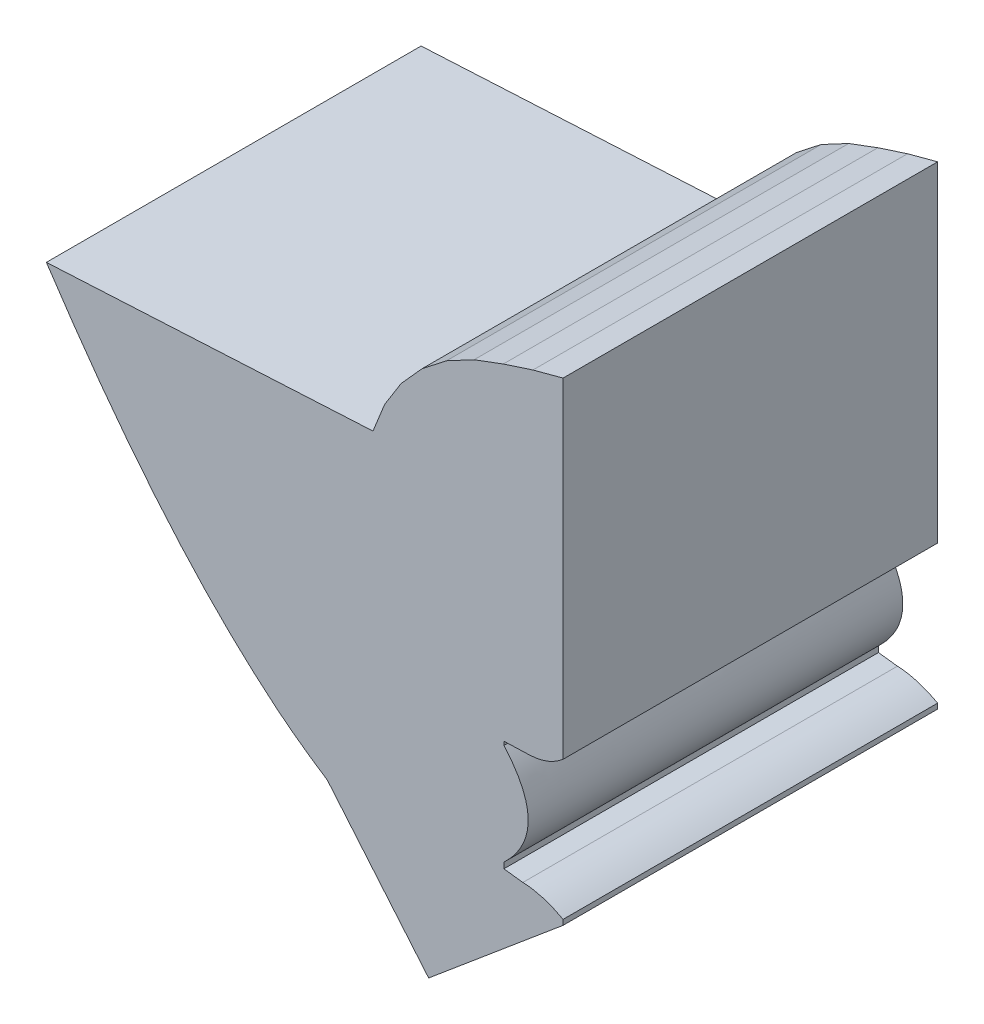
ISO-10303-21;
HEADER;
FILE_DESCRIPTION(('STEP AP214'),'2;1');
FILE_NAME('part.step','',(''),(''),'','','');
FILE_SCHEMA(('AUTOMOTIVE_DESIGN { 1 0 10303 214 1 1 1 1 }'));
ENDSEC;
DATA;
#1=APPLICATION_CONTEXT('core data for automotive mechanical design processes');
#2=APPLICATION_PROTOCOL_DEFINITION('international standard','automotive_design',2000,#1);
#3=PRODUCT_CONTEXT('',#1,'mechanical');
#4=PRODUCT('Part','Part','',(#3));
#5=PRODUCT_RELATED_PRODUCT_CATEGORY('part','',(#4));
#6=PRODUCT_DEFINITION_FORMATION('','',#4);
#7=PRODUCT_DEFINITION_CONTEXT('part definition',#1,'design');
#8=PRODUCT_DEFINITION('design','',#6,#7);
#9=PRODUCT_DEFINITION_SHAPE('','',#8);
#10=(LENGTH_UNIT() NAMED_UNIT(*) SI_UNIT(.MILLI.,.METRE.));
#11=(NAMED_UNIT(*) PLANE_ANGLE_UNIT() SI_UNIT($,.RADIAN.));
#12=(NAMED_UNIT(*) SI_UNIT($,.STERADIAN.) SOLID_ANGLE_UNIT());
#13=UNCERTAINTY_MEASURE_WITH_UNIT(LENGTH_MEASURE(1.E-05),#10,'distance_accuracy_value','');
#14=(GEOMETRIC_REPRESENTATION_CONTEXT(3) GLOBAL_UNCERTAINTY_ASSIGNED_CONTEXT((#13)) GLOBAL_UNIT_ASSIGNED_CONTEXT((#10,
#11,#12)) REPRESENTATION_CONTEXT('',''));
#15=CARTESIAN_POINT('',(0.,0.,0.));
#16=DIRECTION('',(0.,0.,1.));
#17=DIRECTION('',(1.,0.,0.));
#18=AXIS2_PLACEMENT_3D('',#15,#16,#17);
#19=CARTESIAN_POINT('',(-2.17733041778456,0.,7.21));
#20=DIRECTION('',(1.,0.,0.));
#21=DIRECTION('',(0.,1.,0.));
#22=AXIS2_PLACEMENT_3D('',#19,#20,#21);
#23=PLANE('',#22);
#24=DIRECTION('',(0.,1.,0.));
#25=VECTOR('',#24,1.);
#26=CARTESIAN_POINT('',(-2.17733041778456,0.,7.21));
#27=LINE('',#26,#25);
#28=CARTESIAN_POINT('',(-2.17733041779455,-1.68817652024789,7.21));
#29=VERTEX_POINT('',#28);
#30=CARTESIAN_POINT('',(-2.17733041778456,-1.91156169539301,7.21));
#31=VERTEX_POINT('',#30);
#32=EDGE_CURVE('E555',#29,#31,#27,.F.);
#33=ORIENTED_EDGE('',*,*,#32,.T.);
#34=DIRECTION('',(0.,0.,-1.));
#35=VECTOR('',#34,1.);
#36=CARTESIAN_POINT('',(-2.17733041778456,-1.91156169539301,7.21));
#37=LINE('',#36,#35);
#38=CARTESIAN_POINT('',(-2.17733041778456,-1.91156169539301,-7.21));
#39=VERTEX_POINT('',#38);
#40=EDGE_CURVE('E13',#31,#39,#37,.T.);
#41=ORIENTED_EDGE('',*,*,#40,.T.);
#42=DIRECTION('',(0.,1.,0.));
#43=VECTOR('',#42,1.);
#44=CARTESIAN_POINT('',(-2.17733041778456,0.,-7.21));
#45=LINE('',#44,#43);
#46=CARTESIAN_POINT('',(-2.17733041778456,-1.68817652020115,-7.21));
#47=VERTEX_POINT('',#46);
#48=EDGE_CURVE('E222',#47,#39,#45,.F.);
#49=ORIENTED_EDGE('',*,*,#48,.F.);
#50=DIRECTION('',(0.,0.,-1.));
#51=VECTOR('',#50,1.);
#52=CARTESIAN_POINT('',(-2.17733041778328,-1.68817652023794,30.8299178698776));
#53=LINE('',#52,#51);
#54=EDGE_CURVE('E595',#29,#47,#53,.T.);
#55=ORIENTED_EDGE('',*,*,#54,.F.);
#56=EDGE_LOOP('',(#33,#41,#49,#55));
#57=FACE_BOUND('',#56,.T.);
#58=ADVANCED_FACE('F59',(#57),#23,.T.);
#59=CARTESIAN_POINT('',(-82931.1005830976,996560.072871644,30.8299178698776));
#60=CARTESIAN_POINT('',(87153.8887538027,-996199.093812144,30.8299178698776));
#61=CARTESIAN_POINT('',(-91384.0928999308,995820.531871049,30.8299178698776));
#62=B_SPLINE_CURVE_WITH_KNOTS('',2,(#59,#60,#61),.UNSPECIFIED.,.F.,.F.,(3,3),(0.,1.),.UNSPECIFIED.);
#63=DIRECTION('',(0.,0.,-1.));
#64=VECTOR('',#63,1.);
#65=SURFACE_OF_LINEAR_EXTRUSION('',#62,#64);
#66=CARTESIAN_POINT('',(-10.3360060158814,-1.39847805227686,-7.21));
#67=CARTESIAN_POINT('',(-9.65069552469905,-1.92048804823903,-7.21));
#68=CARTESIAN_POINT('',(-8.97324904069641,-2.35261203082771,-7.21));
#69=B_SPLINE_CURVE_WITH_KNOTS('',2,(#66,#67,#68),.UNSPECIFIED.,.F.,.F.,(3,3),(0.50081483398574,
0.500965025000237),.UNSPECIFIED.);
#70=CARTESIAN_POINT('',(-10.3360060158632,-1.39847805228234,-7.2125366176972));
#71=VERTEX_POINT('',#70);
#72=CARTESIAN_POINT('',(-8.97324903911193,-2.35261203133745,-7.21));
#73=VERTEX_POINT('',#72);
#74=EDGE_CURVE('E551',#71,#73,#69,.T.);
#75=ORIENTED_EDGE('',*,*,#74,.T.);
#76=DIRECTION('',(0.,0.,-1.));
#77=VECTOR('',#76,1.);
#78=CARTESIAN_POINT('',(-8.97324903822749,-2.35261203239279,0.));
#79=LINE('',#78,#77);
#80=CARTESIAN_POINT('',(-8.97324904075851,-2.35261203079572,7.21));
#81=VERTEX_POINT('',#80);
#82=EDGE_CURVE('E65',#73,#81,#79,.F.);
#83=ORIENTED_EDGE('',*,*,#82,.T.);
#84=CARTESIAN_POINT('',(-8.97324904075525,-2.35261203078885,7.21));
#85=CARTESIAN_POINT('',(-9.65069552472817,-1.92048804821554,7.21));
#86=CARTESIAN_POINT('',(-10.3360060158801,-1.39847805227672,7.21));
#87=B_SPLINE_CURVE_WITH_KNOTS('',2,(#84,#85,#86),.UNSPECIFIED.,.F.,.F.,(3,3),(0.500814833985746,
0.500965025000236),.UNSPECIFIED.);
#88=CARTESIAN_POINT('',(-10.3360060158816,-1.39847805227263,7.21251805157951));
#89=VERTEX_POINT('',#88);
#90=EDGE_CURVE('E521',#89,#81,#87,.F.);
#91=ORIENTED_EDGE('',*,*,#90,.F.);
#92=CARTESIAN_POINT('',(-10.336006015861,-1.39847805228632,7.21));
#93=CARTESIAN_POINT('',(-10.6228848167366,-1.17995870432205,7.21));
#94=CARTESIAN_POINT('',(-10.9111416710362,-0.945688133646021,7.21));
#95=B_SPLINE_CURVE_WITH_KNOTS('',2,(#92,#93,#94),.UNSPECIFIED.,.F.,.F.,(3,3),(0.500965025000234,
0.501027896674745),.UNSPECIFIED.);
#96=CARTESIAN_POINT('',(-10.9111416711035,-0.945688133586594,7.21251805157951));
#97=VERTEX_POINT('',#96);
#98=EDGE_CURVE('E456',#97,#89,#95,.F.);
#99=ORIENTED_EDGE('',*,*,#98,.F.);
#100=CARTESIAN_POINT('',(-10.9111416711694,-0.945688133531575,7.21));
#101=CARTESIAN_POINT('',(-15.1971813204195,2.53763911301365,7.21));
#102=CARTESIAN_POINT('',(-19.7878835648669,9.50327575735757,7.21));
#103=B_SPLINE_CURVE_WITH_KNOTS('',2,(#100,#101,#102),.UNSPECIFIED.,.F.,.F.,(3,3),
(0.501027896674761,0.501962724366634),.UNSPECIFIED.);
#104=CARTESIAN_POINT('',(-19.7878835648708,9.50327575735899,7.21251805157951));
#105=VERTEX_POINT('',#104);
#106=EDGE_CURVE('E514',#105,#97,#103,.F.);
#107=ORIENTED_EDGE('',*,*,#106,.F.);
#108=DIRECTION('',(0.,0.,1.));
#109=VECTOR('',#108,1.);
#110=CARTESIAN_POINT('',(-19.7878835648708,9.50327575735899,-7.21507323539439));
#111=LINE('',#110,#109);
#112=CARTESIAN_POINT('',(-19.7878835648708,9.50327575735899,-7.21253661769719));
#113=VERTEX_POINT('',#112);
#114=EDGE_CURVE('E361',#113,#105,#111,.T.);
#115=ORIENTED_EDGE('',*,*,#114,.F.);
#116=CARTESIAN_POINT('',(-19.7878835648714,9.50327575734023,-7.21));
#117=CARTESIAN_POINT('',(-15.197181319061,2.53763911092818,-7.21));
#118=CARTESIAN_POINT('',(-10.9111416686287,-0.945688135617351,-7.21));
#119=B_SPLINE_CURVE_WITH_KNOTS('',2,(#116,#117,#118),.UNSPECIFIED.,.F.,.F.,(3,3),
(0.501027896674483,0.501962724366634),.UNSPECIFIED.);
#120=CARTESIAN_POINT('',(-10.9111416684846,-0.945688135711886,-7.21253661769719));
#121=VERTEX_POINT('',#120);
#122=EDGE_CURVE('E501',#113,#121,#119,.T.);
#123=ORIENTED_EDGE('',*,*,#122,.T.);
#124=CARTESIAN_POINT('',(-10.9111416684921,-0.945688135713634,-7.21));
#125=CARTESIAN_POINT('',(-10.6228848154707,-1.17995870528634,-7.21));
#126=CARTESIAN_POINT('',(-10.336006015861,-1.39847805228632,-7.21));
#127=B_SPLINE_CURVE_WITH_KNOTS('',2,(#124,#125,#126),.UNSPECIFIED.,.F.,.F.,(3,3),
(0.500965025000234,0.501027896674468),.UNSPECIFIED.);
#128=EDGE_CURVE('E447',#121,#71,#127,.T.);
#129=ORIENTED_EDGE('',*,*,#128,.T.);
#130=EDGE_LOOP('',(#75,#83,#91,#99,#107,#115,#123,#129));
#131=FACE_BOUND('',#130,.T.);
#132=ADVANCED_FACE('F417',(#131),#65,.T.);
#133=DIRECTION('',(0.,1.,0.));
#134=VECTOR('',#133,1.);
#135=CARTESIAN_POINT('',(-2.17733041778456,0.,-7.21));
#136=LINE('',#135,#134);
#137=CARTESIAN_POINT('',(-2.17733041778456,2.34248700715526,-7.21));
#138=VERTEX_POINT('',#137);
#139=CARTESIAN_POINT('',(-2.17733041777607,2.20172974209443,-7.21));
#140=VERTEX_POINT('',#139);
#141=EDGE_CURVE('E539',#138,#140,#136,.F.);
#142=ORIENTED_EDGE('',*,*,#141,.F.);
#143=DIRECTION('',(0.,0.,-1.));
#144=VECTOR('',#143,1.);
#145=CARTESIAN_POINT('',(-2.17733041778456,2.34248700715526,24.0565253000013));
#146=LINE('',#145,#144);
#147=CARTESIAN_POINT('',(-2.17733041778456,2.34248700715526,7.21));
#148=VERTEX_POINT('',#147);
#149=EDGE_CURVE('E354',#148,#138,#146,.T.);
#150=ORIENTED_EDGE('',*,*,#149,.F.);
#151=DIRECTION('',(0.,1.,0.));
#152=VECTOR('',#151,1.);
#153=CARTESIAN_POINT('',(-2.17733041778456,0.,7.21));
#154=LINE('',#153,#152);
#155=CARTESIAN_POINT('',(-2.17733041778074,2.20172974210003,7.21));
#156=VERTEX_POINT('',#155);
#157=EDGE_CURVE('E548',#148,#156,#154,.F.);
#158=ORIENTED_EDGE('',*,*,#157,.T.);
#159=DIRECTION('',(0.,0.,-1.));
#160=VECTOR('',#159,1.);
#161=CARTESIAN_POINT('',(-2.17733041778074,2.20172974210003,30.8299178698776));
#162=LINE('',#161,#160);
#163=EDGE_CURVE('E647',#156,#140,#162,.T.);
#164=ORIENTED_EDGE('',*,*,#163,.T.);
#165=EDGE_LOOP('',(#142,#150,#158,#164));
#166=FACE_BOUND('',#165,.T.);
#167=ADVANCED_FACE('F423',(#166),#23,.T.);
#168=CARTESIAN_POINT('',(0.,0.,7.21));
#169=DIRECTION('',(0.,0.,1.));
#170=DIRECTION('',(1.,0.,0.));
#171=AXIS2_PLACEMENT_3D('',#168,#169,#170);
#172=PLANE('',#171);
#173=ORIENTED_EDGE('',*,*,#90,.T.);
#174=DIRECTION('',(0.642787609686551,-0.766044443118968,0.));
#175=VECTOR('',#174,1.);
#176=CARTESIAN_POINT('',(-10.1686504973581,-0.927988048880245,7.21));
#177=LINE('',#176,#175);
#178=CARTESIAN_POINT('',(-5.07362750866933,-7.,7.21));
#179=VERTEX_POINT('',#178);
#180=EDGE_CURVE('E71',#81,#179,#177,.T.);
#181=ORIENTED_EDGE('',*,*,#180,.T.);
#182=DIRECTION('',(0.766044443118974,0.642787609686544,0.));
#183=VECTOR('',#182,1.);
#184=CARTESIAN_POINT('',(0.100000000004221,-2.65881106562334,7.21));
#185=LINE('',#184,#183);
#186=CARTESIAN_POINT('',(0.100000000004221,-2.65881106562334,7.21));
#187=VERTEX_POINT('',#186);
#188=EDGE_CURVE('E250',#179,#187,#185,.T.);
#189=ORIENTED_EDGE('',*,*,#188,.T.);
#190=DIRECTION('',(-1.62011653008151E-11,1.,0.));
#191=VECTOR('',#190,1.);
#192=CARTESIAN_POINT('',(0.100000000000981,-2.45881106562334,7.21));
#193=LINE('',#192,#191);
#194=CARTESIAN_POINT('',(0.100000000000981,-2.45881106562334,7.21));
#195=VERTEX_POINT('',#194);
#196=EDGE_CURVE('E601',#187,#195,#193,.T.);
#197=ORIENTED_EDGE('',*,*,#196,.T.);
#198=CARTESIAN_POINT('',(-15004.7897636461,-999892.444646946,7.21));
#199=CARTESIAN_POINT('',(17450.906437277,999845.695156391,7.21));
#200=CARTESIAN_POINT('',(-19903.023110908,-999806.945665836,7.21));
#201=B_SPLINE_CURVE_WITH_KNOTS('',2,(#198,#199,#200),.UNSPECIFIED.,.F.,.F.,(3,3),(0.,1.),.UNSPECIFIED.);
#202=CARTESIAN_POINT('',(-1.44765075676889,-2.00137084805176,7.21));
#203=VERTEX_POINT('',#202);
#204=EDGE_CURVE('E598',#195,#203,#201,.T.);
#205=ORIENTED_EDGE('',*,*,#204,.T.);
#206=DIRECTION('',(-0.992510610974,0.122158450808844,0.));
#207=VECTOR('',#206,1.);
#208=CARTESIAN_POINT('',(-1.44765075676889,-2.00137084805176,7.21));
#209=LINE('',#208,#207);
#210=EDGE_CURVE('E230',#203,#31,#209,.T.);
#211=ORIENTED_EDGE('',*,*,#210,.T.);
#212=ORIENTED_EDGE('',*,*,#32,.F.);
#213=CARTESIAN_POINT('',(-2.17733041777607,2.20172974209443,7.21));
#214=CARTESIAN_POINT('',(-0.307419303310444,0.0931805865995528,7.21));
#215=CARTESIAN_POINT('',(-2.17733041779435,-1.68817652026,7.21));
#216=B_SPLINE_CURVE_WITH_KNOTS('',2,(#213,#214,#215),.UNSPECIFIED.,.F.,.F.,(3,3),
(0.49947186766891,0.500440643667569),.UNSPECIFIED.);
#217=EDGE_CURVE('E597',#156,#29,#216,.T.);
#218=ORIENTED_EDGE('',*,*,#217,.F.);
#219=ORIENTED_EDGE('',*,*,#157,.F.);
#220=DIRECTION('',(0.999390827019096,0.0348994967025048,0.));
#221=VECTOR('',#220,1.);
#222=CARTESIAN_POINT('',(-2.17733041778456,2.34248700715526,7.21));
#223=LINE('',#222,#221);
#224=CARTESIAN_POINT('',(-1.19050164048462,2.37694782742692,7.21000000000002));
#225=VERTEX_POINT('',#224);
#226=EDGE_CURVE('E78',#148,#225,#223,.T.);
#227=ORIENTED_EDGE('',*,*,#226,.T.);
#228=CARTESIAN_POINT('',(-343900.072311573,939011.080499257,7.21000000000001));
#229=CARTESIAN_POINT('',(342019.599581338,-939690.120785908,7.21000000000001));
#230=CARTESIAN_POINT('',(-340141.301828429,940379.16107256,7.21000000000001));
#231=B_SPLINE_CURVE_WITH_KNOTS('',2,(#228,#229,#230),.UNSPECIFIED.,.F.,.F.,(3,3),(0.,1.),.UNSPECIFIED.);
#232=CARTESIAN_POINT('',(0.100000000004221,2.87767341815847,7.21000000000001));
#233=VERTEX_POINT('',#232);
#234=EDGE_CURVE('E296',#225,#233,#231,.T.);
#235=ORIENTED_EDGE('',*,*,#234,.T.);
#236=DIRECTION('',(0.,1.,0.));
#237=VECTOR('',#236,1.);
#238=CARTESIAN_POINT('',(0.100000000004221,2.87767341815847,7.21));
#239=LINE('',#238,#237);
#240=CARTESIAN_POINT('',(0.100000000004747,15.587903347272,7.21));
#241=VERTEX_POINT('',#240);
#242=EDGE_CURVE('E331',#233,#241,#239,.T.);
#243=ORIENTED_EDGE('',*,*,#242,.T.);
#244=DIRECTION('',(-0.96592582628907,-0.258819045102515,0.));
#245=VECTOR('',#244,1.);
#246=CARTESIAN_POINT('',(-1.05911099154214,15.277320493149,7.21));
#247=LINE('',#246,#245);
#248=CARTESIAN_POINT('',(-1.05911099154214,15.277320493149,7.21000000000001));
#249=VERTEX_POINT('',#248);
#250=EDGE_CURVE('E326',#241,#249,#247,.T.);
#251=ORIENTED_EDGE('',*,*,#250,.T.);
#252=DIRECTION('',(-0.951056516295155,-0.309016994374943,0.));
#253=VECTOR('',#252,1.);
#254=CARTESIAN_POINT('',(-2.20037881109632,14.906500099899,7.21));
#255=LINE('',#254,#253);
#256=CARTESIAN_POINT('',(-2.20037881109632,14.906500099899,7.21000000000001));
#257=VERTEX_POINT('',#256);
#258=EDGE_CURVE('E327',#249,#257,#255,.T.);
#259=ORIENTED_EDGE('',*,*,#258,.T.);
#260=DIRECTION('',(-0.9366721892484,-0.350207381259461,0.));
#261=VECTOR('',#260,1.);
#262=CARTESIAN_POINT('',(-3.3243854381944,14.4862512423877,7.21));
#263=LINE('',#262,#261);
#264=CARTESIAN_POINT('',(-3.3243854381944,14.4862512423877,7.21000000000001));
#265=VERTEX_POINT('',#264);
#266=EDGE_CURVE('E324',#257,#265,#263,.T.);
#267=ORIENTED_EDGE('',*,*,#266,.T.);
#268=DIRECTION('',(-0.882947592859007,-0.46947156278574,0.));
#269=VECTOR('',#268,1.);
#270=CARTESIAN_POINT('',(-4.38392254962521,13.9228853670448,7.21));
#271=LINE('',#270,#269);
#272=CARTESIAN_POINT('',(-4.38392254962521,13.9228853670448,7.21000000000001));
#273=VERTEX_POINT('',#272);
#274=EDGE_CURVE('E318',#265,#273,#271,.T.);
#275=ORIENTED_EDGE('',*,*,#274,.T.);
#276=DIRECTION('',(-0.788010753606726,-0.615661475325654,0.));
#277=VECTOR('',#276,1.);
#278=CARTESIAN_POINT('',(-5.32953545395328,13.184091596654,7.21));
#279=LINE('',#278,#277);
#280=CARTESIAN_POINT('',(-5.32953545395328,13.184091596654,7.21000000000001));
#281=VERTEX_POINT('',#280);
#282=EDGE_CURVE('E320',#273,#281,#279,.T.);
#283=ORIENTED_EDGE('',*,*,#282,.T.);
#284=DIRECTION('',(-0.669130606358526,-0.743144825477694,0.));
#285=VECTOR('',#284,1.);
#286=CARTESIAN_POINT('',(-6.13249218158351,12.2923178060808,7.21));
#287=LINE('',#286,#285);
#288=CARTESIAN_POINT('',(-6.13249218158351,12.2923178060808,7.21000000000001));
#289=VERTEX_POINT('',#288);
#290=EDGE_CURVE('E313',#281,#289,#287,.T.);
#291=ORIENTED_EDGE('',*,*,#290,.T.);
#292=DIRECTION('',(-0.52991926423321,-0.848048096156423,0.));
#293=VECTOR('',#292,1.);
#294=CARTESIAN_POINT('',(-6.76839529866336,11.2746600906931,7.21));
#295=LINE('',#294,#293);
#296=CARTESIAN_POINT('',(-6.76839529866336,11.2746600906931,7.21000000000001));
#297=VERTEX_POINT('',#296);
#298=EDGE_CURVE('E311',#289,#297,#295,.T.);
#299=ORIENTED_EDGE('',*,*,#298,.T.);
#300=DIRECTION('',(-0.374606593415918,-0.927183854566785,0.));
#301=VECTOR('',#300,1.);
#302=CARTESIAN_POINT('',(-7.21792321076246,10.1620394652129,7.21));
#303=LINE('',#302,#301);
#304=CARTESIAN_POINT('',(-7.21792321076246,10.1620394652129,7.21000000000001));
#305=VERTEX_POINT('',#304);
#306=EDGE_CURVE('E308',#297,#305,#303,.T.);
#307=ORIENTED_EDGE('',*,*,#306,.T.);
#308=DIRECTION('',(-0.998629534754494,-0.0523359562444688,0.));
#309=VECTOR('',#308,1.);
#310=CARTESIAN_POINT('',(-10.3098203952063,10.,7.21));
#311=LINE('',#310,#309);
#312=EDGE_CURVE('E303',#305,#105,#311,.T.);
#313=ORIENTED_EDGE('',*,*,#312,.T.);
#314=ORIENTED_EDGE('',*,*,#106,.T.);
#315=ORIENTED_EDGE('',*,*,#98,.T.);
#316=EDGE_LOOP('',(#173,#181,#189,#197,#205,#211,#212,#218,#219,#227,#235,#243,#251,#259,#267,
#275,#283,#291,#299,#307,#313,#314,#315));
#317=FACE_BOUND('',#316,.T.);
#318=ADVANCED_FACE('F482',(#317),#172,.T.);
#319=CARTESIAN_POINT('',(0.,0.,-7.21));
#320=DIRECTION('',(0.,0.,1.));
#321=DIRECTION('',(1.,0.,0.));
#322=AXIS2_PLACEMENT_3D('',#319,#320,#321);
#323=PLANE('',#322);
#324=ORIENTED_EDGE('',*,*,#48,.T.);
#325=DIRECTION('',(0.992510610974,-0.122158450808844,0.));
#326=VECTOR('',#325,1.);
#327=CARTESIAN_POINT('',(-1.44765075676889,-2.00137084805176,-7.21));
#328=LINE('',#327,#326);
#329=CARTESIAN_POINT('',(-1.44765075676889,-2.00137084805176,-7.21));
#330=VERTEX_POINT('',#329);
#331=EDGE_CURVE('E214',#39,#330,#328,.T.);
#332=ORIENTED_EDGE('',*,*,#331,.T.);
#333=CARTESIAN_POINT('',(-15004.7897636461,-999892.444646946,-7.21));
#334=CARTESIAN_POINT('',(17450.906437277,999845.695156391,-7.21));
#335=CARTESIAN_POINT('',(-19903.023110908,-999806.945665836,-7.21));
#336=B_SPLINE_CURVE_WITH_KNOTS('',2,(#333,#334,#335),.UNSPECIFIED.,.F.,.F.,(3,3),(0.,1.),.UNSPECIFIED.);
#337=CARTESIAN_POINT('',(0.100000000000981,-2.45881106562334,-7.21));
#338=VERTEX_POINT('',#337);
#339=EDGE_CURVE('E220',#330,#338,#336,.F.);
#340=ORIENTED_EDGE('',*,*,#339,.T.);
#341=DIRECTION('',(1.62011653008151E-11,-1.,0.));
#342=VECTOR('',#341,1.);
#343=CARTESIAN_POINT('',(0.100000000000981,-2.45881106562334,-7.21));
#344=LINE('',#343,#342);
#345=CARTESIAN_POINT('',(0.100000000004221,-2.65881106562334,-7.21));
#346=VERTEX_POINT('',#345);
#347=EDGE_CURVE('E236',#338,#346,#344,.T.);
#348=ORIENTED_EDGE('',*,*,#347,.T.);
#349=DIRECTION('',(-0.766044443118974,-0.642787609686544,0.));
#350=VECTOR('',#349,1.);
#351=CARTESIAN_POINT('',(0.100000000004221,-2.65881106562334,-7.21));
#352=LINE('',#351,#350);
#353=CARTESIAN_POINT('',(-5.07362750866933,-7.,-7.21));
#354=VERTEX_POINT('',#353);
#355=EDGE_CURVE('E238',#346,#354,#352,.T.);
#356=ORIENTED_EDGE('',*,*,#355,.T.);
#357=DIRECTION('',(-0.642787609686551,0.766044443118968,0.));
#358=VECTOR('',#357,1.);
#359=CARTESIAN_POINT('',(-10.1686504973581,-0.927988048880245,-7.21));
#360=LINE('',#359,#358);
#361=EDGE_CURVE('E257',#354,#73,#360,.T.);
#362=ORIENTED_EDGE('',*,*,#361,.T.);
#363=ORIENTED_EDGE('',*,*,#74,.F.);
#364=ORIENTED_EDGE('',*,*,#128,.F.);
#365=ORIENTED_EDGE('',*,*,#122,.F.);
#366=DIRECTION('',(-0.998629534754494,-0.0523359562444688,0.));
#367=VECTOR('',#366,1.);
#368=CARTESIAN_POINT('',(-0.550881453784725,10.5114443180936,-7.21));
#369=LINE('',#368,#367);
#370=CARTESIAN_POINT('',(-7.21792321076246,10.1620394652129,-7.21));
#371=VERTEX_POINT('',#370);
#372=EDGE_CURVE('E530',#371,#113,#369,.T.);
#373=ORIENTED_EDGE('',*,*,#372,.F.);
#374=DIRECTION('',(0.374606593415918,0.927183854566785,0.));
#375=VECTOR('',#374,1.);
#376=CARTESIAN_POINT('',(-7.21792321076246,10.1620394652129,-7.21));
#377=LINE('',#376,#375);
#378=CARTESIAN_POINT('',(-6.76839529866336,11.2746600906931,-7.21));
#379=VERTEX_POINT('',#378);
#380=EDGE_CURVE('E274',#371,#379,#377,.T.);
#381=ORIENTED_EDGE('',*,*,#380,.T.);
#382=DIRECTION('',(0.52991926423321,0.848048096156423,0.));
#383=VECTOR('',#382,1.);
#384=CARTESIAN_POINT('',(-6.76839529866336,11.2746600906931,-7.21));
#385=LINE('',#384,#383);
#386=CARTESIAN_POINT('',(-6.13249218158351,12.2923178060808,-7.21));
#387=VERTEX_POINT('',#386);
#388=EDGE_CURVE('E272',#379,#387,#385,.T.);
#389=ORIENTED_EDGE('',*,*,#388,.T.);
#390=DIRECTION('',(0.669130606358526,0.743144825477694,0.));
#391=VECTOR('',#390,1.);
#392=CARTESIAN_POINT('',(-6.13249218158351,12.2923178060808,-7.21));
#393=LINE('',#392,#391);
#394=CARTESIAN_POINT('',(-5.32953545395328,13.184091596654,-7.21));
#395=VERTEX_POINT('',#394);
#396=EDGE_CURVE('E270',#387,#395,#393,.T.);
#397=ORIENTED_EDGE('',*,*,#396,.T.);
#398=DIRECTION('',(0.788010753606726,0.615661475325654,0.));
#399=VECTOR('',#398,1.);
#400=CARTESIAN_POINT('',(-5.32953545395328,13.184091596654,-7.21));
#401=LINE('',#400,#399);
#402=CARTESIAN_POINT('',(-4.38392254962521,13.9228853670448,-7.21));
#403=VERTEX_POINT('',#402);
#404=EDGE_CURVE('E263',#395,#403,#401,.T.);
#405=ORIENTED_EDGE('',*,*,#404,.T.);
#406=DIRECTION('',(0.882947592859007,0.46947156278574,0.));
#407=VECTOR('',#406,1.);
#408=CARTESIAN_POINT('',(-4.38392254962521,13.9228853670448,-7.21));
#409=LINE('',#408,#407);
#410=CARTESIAN_POINT('',(-3.3243854381944,14.4862512423877,-7.21));
#411=VERTEX_POINT('',#410);
#412=EDGE_CURVE('E264',#403,#411,#409,.T.);
#413=ORIENTED_EDGE('',*,*,#412,.T.);
#414=DIRECTION('',(0.9366721892484,0.350207381259461,0.));
#415=VECTOR('',#414,1.);
#416=CARTESIAN_POINT('',(-3.3243854381944,14.4862512423877,-7.21));
#417=LINE('',#416,#415);
#418=CARTESIAN_POINT('',(-2.20037881109632,14.906500099899,-7.21000000000001));
#419=VERTEX_POINT('',#418);
#420=EDGE_CURVE('E249',#411,#419,#417,.T.);
#421=ORIENTED_EDGE('',*,*,#420,.T.);
#422=DIRECTION('',(0.951056516295155,0.309016994374943,0.));
#423=VECTOR('',#422,1.);
#424=CARTESIAN_POINT('',(-2.20037881109632,14.906500099899,-7.21));
#425=LINE('',#424,#423);
#426=CARTESIAN_POINT('',(-1.05911099154214,15.277320493149,-7.21));
#427=VERTEX_POINT('',#426);
#428=EDGE_CURVE('E295',#419,#427,#425,.T.);
#429=ORIENTED_EDGE('',*,*,#428,.T.);
#430=DIRECTION('',(0.96592582628907,0.258819045102515,0.));
#431=VECTOR('',#430,1.);
#432=CARTESIAN_POINT('',(-1.05911099154214,15.277320493149,-7.21));
#433=LINE('',#432,#431);
#434=CARTESIAN_POINT('',(0.100000000004747,15.587903347272,-7.21));
#435=VERTEX_POINT('',#434);
#436=EDGE_CURVE('E293',#427,#435,#433,.T.);
#437=ORIENTED_EDGE('',*,*,#436,.T.);
#438=DIRECTION('',(0.,-1.,0.));
#439=VECTOR('',#438,1.);
#440=CARTESIAN_POINT('',(0.100000000004221,2.87767341815847,-7.21));
#441=LINE('',#440,#439);
#442=CARTESIAN_POINT('',(0.0999999999995449,2.8776734181557,-7.21000000000001));
#443=VERTEX_POINT('',#442);
#444=EDGE_CURVE('E283',#435,#443,#441,.T.);
#445=ORIENTED_EDGE('',*,*,#444,.T.);
#446=CARTESIAN_POINT('',(-343900.072311573,939011.080499257,-7.21000000000001));
#447=CARTESIAN_POINT('',(342019.599581338,-939690.120785908,-7.21000000000001));
#448=CARTESIAN_POINT('',(-340141.301828429,940379.16107256,-7.21000000000001));
#449=B_SPLINE_CURVE_WITH_KNOTS('',2,(#446,#447,#448),.UNSPECIFIED.,.F.,.F.,(3,3),(0.,1.),.UNSPECIFIED.);
#450=CARTESIAN_POINT('',(-1.19050164048462,2.37694782741517,-7.21));
#451=VERTEX_POINT('',#450);
#452=EDGE_CURVE('E280',#443,#451,#449,.F.);
#453=ORIENTED_EDGE('',*,*,#452,.T.);
#454=DIRECTION('',(-0.999390827019096,-0.0348994967025048,0.));
#455=VECTOR('',#454,1.);
#456=CARTESIAN_POINT('',(-2.17733041778456,2.34248700715526,-7.21));
#457=LINE('',#456,#455);
#458=EDGE_CURVE('E277',#451,#138,#457,.T.);
#459=ORIENTED_EDGE('',*,*,#458,.T.);
#460=ORIENTED_EDGE('',*,*,#141,.T.);
#461=CARTESIAN_POINT('',(-2.17733041776379,-1.68817652023098,-7.21));
#462=CARTESIAN_POINT('',(-0.307419303328964,0.0931805866132554,-7.21));
#463=CARTESIAN_POINT('',(-2.17733041776824,2.20172974208621,-7.21));
#464=B_SPLINE_CURVE_WITH_KNOTS('',2,(#461,#462,#463),.UNSPECIFIED.,.F.,.F.,(3,3),
(0.499471867668912,0.500440643667561),.UNSPECIFIED.);
#465=EDGE_CURVE('E648',#47,#140,#464,.T.);
#466=ORIENTED_EDGE('',*,*,#465,.F.);
#467=EDGE_LOOP('',(#324,#332,#340,#348,#356,#362,#363,#364,#365,#373,#381,#389,#397,#405,#413,
#421,#429,#437,#445,#453,#459,#460,#466));
#468=FACE_BOUND('',#467,.T.);
#469=ADVANCED_FACE('F215',(#468),#323,.F.);
#470=CARTESIAN_POINT('',(-996021.636606251,89148.1321438377,30.8299178698776));
#471=CARTESIAN_POINT('',(996193.448091746,-87155.7427476542,30.8299178698776));
#472=CARTESIAN_POINT('',(-996370.259577241,85163.3533514707,30.8299178698776));
#473=B_SPLINE_CURVE_WITH_KNOTS('',2,(#470,#471,#472),.UNSPECIFIED.,.F.,.F.,(3,3),(0.,1.),.UNSPECIFIED.);
#474=DIRECTION('',(0.,0.,-1.));
#475=VECTOR('',#474,1.);
#476=SURFACE_OF_LINEAR_EXTRUSION('',#473,#475);
#477=ORIENTED_EDGE('',*,*,#163,.F.);
#478=ORIENTED_EDGE('',*,*,#217,.T.);
#479=ORIENTED_EDGE('',*,*,#54,.T.);
#480=ORIENTED_EDGE('',*,*,#465,.T.);
#481=EDGE_LOOP('',(#477,#478,#479,#480));
#482=FACE_BOUND('',#481,.T.);
#483=ADVANCED_FACE('F411',(#482),#476,.T.);
#484=CARTESIAN_POINT('',(-19.7878835648708,9.50327575735899,-7.21507323539439));
#485=DIRECTION('',(-0.0523359562444688,0.998629534754494,0.));
#486=DIRECTION('',(-0.998629534754494,-0.0523359562444688,0.));
#487=AXIS2_PLACEMENT_3D('',#484,#485,#486);
#488=PLANE('',#487);
#489=ORIENTED_EDGE('',*,*,#312,.F.);
#490=DIRECTION('',(0.,0.,-1.));
#491=VECTOR('',#490,1.);
#492=CARTESIAN_POINT('',(-7.21792321076246,10.1620394652129,24.0565253000013));
#493=LINE('',#492,#491);
#494=EDGE_CURVE('E348',#305,#371,#493,.T.);
#495=ORIENTED_EDGE('',*,*,#494,.T.);
#496=ORIENTED_EDGE('',*,*,#372,.T.);
#497=ORIENTED_EDGE('',*,*,#114,.T.);
#498=EDGE_LOOP('',(#489,#495,#496,#497));
#499=FACE_BOUND('',#498,.T.);
#500=ADVANCED_FACE('F410',(#499),#488,.T.);
#501=CARTESIAN_POINT('',(-1.05911099154214,15.277320493149,24.0565253000013));
#502=DIRECTION('',(0.258819045102515,-0.96592582628907,0.));
#503=DIRECTION('',(0.96592582628907,0.258819045102515,0.));
#504=AXIS2_PLACEMENT_3D('',#501,#502,#503);
#505=PLANE('',#504);
#506=ORIENTED_EDGE('',*,*,#250,.F.);
#507=DIRECTION('',(0.,0.,-1.));
#508=VECTOR('',#507,1.);
#509=CARTESIAN_POINT('',(0.100000000004747,15.587903347272,24.0565253000013));
#510=LINE('',#509,#508);
#511=EDGE_CURVE('E300',#241,#435,#510,.T.);
#512=ORIENTED_EDGE('',*,*,#511,.T.);
#513=ORIENTED_EDGE('',*,*,#436,.F.);
#514=DIRECTION('',(0.,0.,-1.));
#515=VECTOR('',#514,1.);
#516=CARTESIAN_POINT('',(-1.05911099154214,15.277320493149,24.0565253000013));
#517=LINE('',#516,#515);
#518=EDGE_CURVE('E337',#249,#427,#517,.T.);
#519=ORIENTED_EDGE('',*,*,#518,.F.);
#520=EDGE_LOOP('',(#506,#512,#513,#519));
#521=FACE_BOUND('',#520,.T.);
#522=ADVANCED_FACE('F406',(#521),#505,.F.);
#523=CARTESIAN_POINT('',(-2.20037881109632,14.906500099899,24.0565253000013));
#524=DIRECTION('',(0.309016994374943,-0.951056516295155,0.));
#525=DIRECTION('',(0.951056516295155,0.309016994374943,0.));
#526=AXIS2_PLACEMENT_3D('',#523,#524,#525);
#527=PLANE('',#526);
#528=ORIENTED_EDGE('',*,*,#258,.F.);
#529=ORIENTED_EDGE('',*,*,#518,.T.);
#530=ORIENTED_EDGE('',*,*,#428,.F.);
#531=DIRECTION('',(0.,0.,-1.));
#532=VECTOR('',#531,1.);
#533=CARTESIAN_POINT('',(-2.20037881109632,14.906500099899,24.0565253000013));
#534=LINE('',#533,#532);
#535=EDGE_CURVE('E336',#257,#419,#534,.T.);
#536=ORIENTED_EDGE('',*,*,#535,.F.);
#537=EDGE_LOOP('',(#528,#529,#530,#536));
#538=FACE_BOUND('',#537,.T.);
#539=ADVANCED_FACE('F405',(#538),#527,.F.);
#540=CARTESIAN_POINT('',(-3.3243854381944,14.4862512423877,24.0565253000013));
#541=DIRECTION('',(0.350207381259461,-0.9366721892484,0.));
#542=DIRECTION('',(0.9366721892484,0.350207381259461,0.));
#543=AXIS2_PLACEMENT_3D('',#540,#541,#542);
#544=PLANE('',#543);
#545=ORIENTED_EDGE('',*,*,#266,.F.);
#546=ORIENTED_EDGE('',*,*,#535,.T.);
#547=ORIENTED_EDGE('',*,*,#420,.F.);
#548=DIRECTION('',(0.,0.,-1.));
#549=VECTOR('',#548,1.);
#550=CARTESIAN_POINT('',(-3.3243854381944,14.4862512423877,24.0565253000013));
#551=LINE('',#550,#549);
#552=EDGE_CURVE('E338',#265,#411,#551,.T.);
#553=ORIENTED_EDGE('',*,*,#552,.F.);
#554=EDGE_LOOP('',(#545,#546,#547,#553));
#555=FACE_BOUND('',#554,.T.);
#556=ADVANCED_FACE('F400',(#555),#544,.F.);
#557=CARTESIAN_POINT('',(-4.38392254962521,13.9228853670448,24.0565253000013));
#558=DIRECTION('',(0.46947156278574,-0.882947592859007,0.));
#559=DIRECTION('',(0.882947592859007,0.46947156278574,0.));
#560=AXIS2_PLACEMENT_3D('',#557,#558,#559);
#561=PLANE('',#560);
#562=ORIENTED_EDGE('',*,*,#274,.F.);
#563=ORIENTED_EDGE('',*,*,#552,.T.);
#564=ORIENTED_EDGE('',*,*,#412,.F.);
#565=DIRECTION('',(0.,0.,-1.));
#566=VECTOR('',#565,1.);
#567=CARTESIAN_POINT('',(-4.38392254962521,13.9228853670448,24.0565253000013));
#568=LINE('',#567,#566);
#569=EDGE_CURVE('E342',#273,#403,#568,.T.);
#570=ORIENTED_EDGE('',*,*,#569,.F.);
#571=EDGE_LOOP('',(#562,#563,#564,#570));
#572=FACE_BOUND('',#571,.T.);
#573=ADVANCED_FACE('F391',(#572),#561,.F.);
#574=CARTESIAN_POINT('',(-5.32953545395328,13.184091596654,24.0565253000013));
#575=DIRECTION('',(0.615661475325654,-0.788010753606726,0.));
#576=DIRECTION('',(0.788010753606726,0.615661475325654,0.));
#577=AXIS2_PLACEMENT_3D('',#574,#575,#576);
#578=PLANE('',#577);
#579=ORIENTED_EDGE('',*,*,#282,.F.);
#580=ORIENTED_EDGE('',*,*,#569,.T.);
#581=ORIENTED_EDGE('',*,*,#404,.F.);
#582=DIRECTION('',(0.,0.,-1.));
#583=VECTOR('',#582,1.);
#584=CARTESIAN_POINT('',(-5.32953545395328,13.184091596654,24.0565253000013));
#585=LINE('',#584,#583);
#586=EDGE_CURVE('E343',#281,#395,#585,.T.);
#587=ORIENTED_EDGE('',*,*,#586,.F.);
#588=EDGE_LOOP('',(#579,#580,#581,#587));
#589=FACE_BOUND('',#588,.T.);
#590=ADVANCED_FACE('F390',(#589),#578,.F.);
#591=CARTESIAN_POINT('',(-6.13249218158351,12.2923178060808,24.0565253000013));
#592=DIRECTION('',(0.743144825477693,-0.669130606358526,0.));
#593=DIRECTION('',(0.669130606358526,0.743144825477694,0.));
#594=AXIS2_PLACEMENT_3D('',#591,#592,#593);
#595=PLANE('',#594);
#596=ORIENTED_EDGE('',*,*,#290,.F.);
#597=ORIENTED_EDGE('',*,*,#586,.T.);
#598=ORIENTED_EDGE('',*,*,#396,.F.);
#599=DIRECTION('',(0.,0.,-1.));
#600=VECTOR('',#599,1.);
#601=CARTESIAN_POINT('',(-6.13249218158351,12.2923178060808,24.0565253000013));
#602=LINE('',#601,#600);
#603=EDGE_CURVE('E347',#289,#387,#602,.T.);
#604=ORIENTED_EDGE('',*,*,#603,.F.);
#605=EDGE_LOOP('',(#596,#597,#598,#604));
#606=FACE_BOUND('',#605,.T.);
#607=ADVANCED_FACE('F386',(#606),#595,.F.);
#608=CARTESIAN_POINT('',(-6.76839529866336,11.2746600906931,24.0565253000013));
#609=DIRECTION('',(0.848048096156423,-0.52991926423321,0.));
#610=DIRECTION('',(0.52991926423321,0.848048096156423,0.));
#611=AXIS2_PLACEMENT_3D('',#608,#609,#610);
#612=PLANE('',#611);
#613=ORIENTED_EDGE('',*,*,#298,.F.);
#614=ORIENTED_EDGE('',*,*,#603,.T.);
#615=ORIENTED_EDGE('',*,*,#388,.F.);
#616=DIRECTION('',(0.,0.,-1.));
#617=VECTOR('',#616,1.);
#618=CARTESIAN_POINT('',(-6.76839529866336,11.2746600906931,24.0565253000013));
#619=LINE('',#618,#617);
#620=EDGE_CURVE('E350',#297,#379,#619,.T.);
#621=ORIENTED_EDGE('',*,*,#620,.F.);
#622=EDGE_LOOP('',(#613,#614,#615,#621));
#623=FACE_BOUND('',#622,.T.);
#624=ADVANCED_FACE('F385',(#623),#612,.F.);
#625=CARTESIAN_POINT('',(-7.21792321076246,10.1620394652129,24.0565253000013));
#626=DIRECTION('',(0.927183854566785,-0.374606593415918,0.));
#627=DIRECTION('',(0.374606593415918,0.927183854566785,0.));
#628=AXIS2_PLACEMENT_3D('',#625,#626,#627);
#629=PLANE('',#628);
#630=ORIENTED_EDGE('',*,*,#306,.F.);
#631=ORIENTED_EDGE('',*,*,#620,.T.);
#632=ORIENTED_EDGE('',*,*,#380,.F.);
#633=ORIENTED_EDGE('',*,*,#494,.F.);
#634=EDGE_LOOP('',(#630,#631,#632,#633));
#635=FACE_BOUND('',#634,.T.);
#636=ADVANCED_FACE('F378',(#635),#629,.F.);
#637=CARTESIAN_POINT('',(-2.17733041778456,2.34248700715526,24.0565253000013));
#638=DIRECTION('',(-0.0348994967025048,0.999390827019096,0.));
#639=DIRECTION('',(-0.999390827019096,-0.0348994967025048,0.));
#640=AXIS2_PLACEMENT_3D('',#637,#638,#639);
#641=PLANE('',#640);
#642=ORIENTED_EDGE('',*,*,#226,.F.);
#643=ORIENTED_EDGE('',*,*,#149,.T.);
#644=ORIENTED_EDGE('',*,*,#458,.F.);
#645=DIRECTION('',(0.,0.,-1.));
#646=VECTOR('',#645,1.);
#647=CARTESIAN_POINT('',(-1.19050164048462,2.37694782742692,24.0565253000013));
#648=LINE('',#647,#646);
#649=EDGE_CURVE('E353',#225,#451,#648,.T.);
#650=ORIENTED_EDGE('',*,*,#649,.F.);
#651=EDGE_LOOP('',(#642,#643,#644,#650));
#652=FACE_BOUND('',#651,.T.);
#653=ADVANCED_FACE('F372',(#652),#641,.F.);
#654=CARTESIAN_POINT('',(-343900.072311573,939011.080499257,24.0565253000013));
#655=CARTESIAN_POINT('',(342019.599581338,-939690.120785908,24.0565253000013));
#656=CARTESIAN_POINT('',(-340141.301828429,940379.16107256,24.0565253000013));
#657=B_SPLINE_CURVE_WITH_KNOTS('',2,(#654,#655,#656),.UNSPECIFIED.,.F.,.F.,(3,3),(0.,1.),.UNSPECIFIED.);
#658=DIRECTION('',(0.,0.,-1.));
#659=VECTOR('',#658,1.);
#660=SURFACE_OF_LINEAR_EXTRUSION('',#657,#659);
#661=ORIENTED_EDGE('',*,*,#234,.F.);
#662=ORIENTED_EDGE('',*,*,#649,.T.);
#663=ORIENTED_EDGE('',*,*,#452,.F.);
#664=DIRECTION('',(0.,0.,-1.));
#665=VECTOR('',#664,1.);
#666=CARTESIAN_POINT('',(0.100000000004221,2.87767341815847,24.0565253000013));
#667=LINE('',#666,#665);
#668=EDGE_CURVE('E332',#233,#443,#667,.T.);
#669=ORIENTED_EDGE('',*,*,#668,.F.);
#670=EDGE_LOOP('',(#661,#662,#663,#669));
#671=FACE_BOUND('',#670,.T.);
#672=ADVANCED_FACE('F367',(#671),#660,.F.);
#673=CARTESIAN_POINT('',(0.100000000004221,2.87767341815847,24.0565253000013));
#674=DIRECTION('',(-1.,0.,0.));
#675=DIRECTION('',(0.,-1.,0.));
#676=AXIS2_PLACEMENT_3D('',#673,#674,#675);
#677=PLANE('',#676);
#678=ORIENTED_EDGE('',*,*,#242,.F.);
#679=ORIENTED_EDGE('',*,*,#668,.T.);
#680=ORIENTED_EDGE('',*,*,#444,.F.);
#681=ORIENTED_EDGE('',*,*,#511,.F.);
#682=EDGE_LOOP('',(#678,#679,#680,#681));
#683=FACE_BOUND('',#682,.T.);
#684=ADVANCED_FACE('F373',(#683),#677,.F.);
#685=CARTESIAN_POINT('',(-15004.7897636461,-999892.444646946,19.1395646262351));
#686=CARTESIAN_POINT('',(17450.906437277,999845.695156391,19.1395646262351));
#687=CARTESIAN_POINT('',(-19903.023110908,-999806.945665836,19.1395646262351));
#688=B_SPLINE_CURVE_WITH_KNOTS('',2,(#685,#686,#687),.UNSPECIFIED.,.F.,.F.,(3,3),(0.,1.),.UNSPECIFIED.);
#689=DIRECTION('',(0.,0.,-1.));
#690=VECTOR('',#689,1.);
#691=SURFACE_OF_LINEAR_EXTRUSION('',#688,#690);
#692=ORIENTED_EDGE('',*,*,#204,.F.);
#693=DIRECTION('',(0.,0.,-1.));
#694=VECTOR('',#693,1.);
#695=CARTESIAN_POINT('',(0.100000000000981,-2.45881106562334,19.1395646262351));
#696=LINE('',#695,#694);
#697=EDGE_CURVE('E224',#195,#338,#696,.T.);
#698=ORIENTED_EDGE('',*,*,#697,.T.);
#699=ORIENTED_EDGE('',*,*,#339,.F.);
#700=DIRECTION('',(0.,0.,-1.));
#701=VECTOR('',#700,1.);
#702=CARTESIAN_POINT('',(-1.44765075676889,-2.00137084805176,19.1395646262351));
#703=LINE('',#702,#701);
#704=EDGE_CURVE('E228',#203,#330,#703,.T.);
#705=ORIENTED_EDGE('',*,*,#704,.F.);
#706=EDGE_LOOP('',(#692,#698,#699,#705));
#707=FACE_BOUND('',#706,.T.);
#708=ADVANCED_FACE('F232',(#707),#691,.F.);
#709=CARTESIAN_POINT('',(-1.44765075676889,-2.00137084805176,19.1395646262351));
#710=DIRECTION('',(-0.122158450808844,-0.992510610974,0.));
#711=DIRECTION('',(0.992510610974,-0.122158450808844,0.));
#712=AXIS2_PLACEMENT_3D('',#709,#710,#711);
#713=PLANE('',#712);
#714=ORIENTED_EDGE('',*,*,#40,.F.);
#715=ORIENTED_EDGE('',*,*,#210,.F.);
#716=ORIENTED_EDGE('',*,*,#704,.T.);
#717=ORIENTED_EDGE('',*,*,#331,.F.);
#718=EDGE_LOOP('',(#714,#715,#716,#717));
#719=FACE_BOUND('',#718,.T.);
#720=ADVANCED_FACE('F227',(#719),#713,.F.);
#721=CARTESIAN_POINT('',(-10.1686504973581,-0.927988048880245,19.1395646262351));
#722=DIRECTION('',(0.766044443118968,0.642787609686551,0.));
#723=DIRECTION('',(-0.642787609686551,0.766044443118968,0.));
#724=AXIS2_PLACEMENT_3D('',#721,#722,#723);
#725=PLANE('',#724);
#726=ORIENTED_EDGE('',*,*,#82,.F.);
#727=ORIENTED_EDGE('',*,*,#361,.F.);
#728=DIRECTION('',(0.,0.,-1.));
#729=VECTOR('',#728,1.);
#730=CARTESIAN_POINT('',(-5.07362750866933,-7.,19.1395646262351));
#731=LINE('',#730,#729);
#732=EDGE_CURVE('E231',#179,#354,#731,.T.);
#733=ORIENTED_EDGE('',*,*,#732,.F.);
#734=ORIENTED_EDGE('',*,*,#180,.F.);
#735=EDGE_LOOP('',(#726,#727,#733,#734));
#736=FACE_BOUND('',#735,.T.);
#737=ADVANCED_FACE('F625',(#736),#725,.F.);
#738=CARTESIAN_POINT('',(0.100000000004221,-2.65881106562334,19.1395646262351));
#739=DIRECTION('',(-0.642787609686544,0.766044443118974,0.));
#740=DIRECTION('',(-0.766044443118974,-0.642787609686544,0.));
#741=AXIS2_PLACEMENT_3D('',#738,#739,#740);
#742=PLANE('',#741);
#743=ORIENTED_EDGE('',*,*,#188,.F.);
#744=ORIENTED_EDGE('',*,*,#732,.T.);
#745=ORIENTED_EDGE('',*,*,#355,.F.);
#746=DIRECTION('',(0.,0.,-1.));
#747=VECTOR('',#746,1.);
#748=CARTESIAN_POINT('',(0.100000000004221,-2.65881106562334,19.1395646262351));
#749=LINE('',#748,#747);
#750=EDGE_CURVE('E602',#187,#346,#749,.T.);
#751=ORIENTED_EDGE('',*,*,#750,.F.);
#752=EDGE_LOOP('',(#743,#744,#745,#751));
#753=FACE_BOUND('',#752,.T.);
#754=ADVANCED_FACE('F622',(#753),#742,.F.);
#755=CARTESIAN_POINT('',(0.100000000000981,-2.45881106562334,19.1395646262351));
#756=DIRECTION('',(-1.,-1.62011653008151E-11,0.));
#757=DIRECTION('',(1.62011653008151E-11,-1.,0.));
#758=AXIS2_PLACEMENT_3D('',#755,#756,#757);
#759=PLANE('',#758);
#760=ORIENTED_EDGE('',*,*,#196,.F.);
#761=ORIENTED_EDGE('',*,*,#750,.T.);
#762=ORIENTED_EDGE('',*,*,#347,.F.);
#763=ORIENTED_EDGE('',*,*,#697,.F.);
#764=EDGE_LOOP('',(#760,#761,#762,#763));
#765=FACE_BOUND('',#764,.T.);
#766=ADVANCED_FACE('F628',(#765),#759,.F.);
#767=CLOSED_SHELL('',(#58,#132,#167,#318,#469,#483,#500,#522,#539,#556,#573,#590,#607,#624,#636,
#653,#672,#684,#708,#720,#737,#754,#766));
#768=MANIFOLD_SOLID_BREP('B2',#767);
#769=ADVANCED_BREP_SHAPE_REPRESENTATION('',(#18,#768),#14);
#770=SHAPE_DEFINITION_REPRESENTATION(#9,#769);
ENDSEC;
END-ISO-10303-21;
